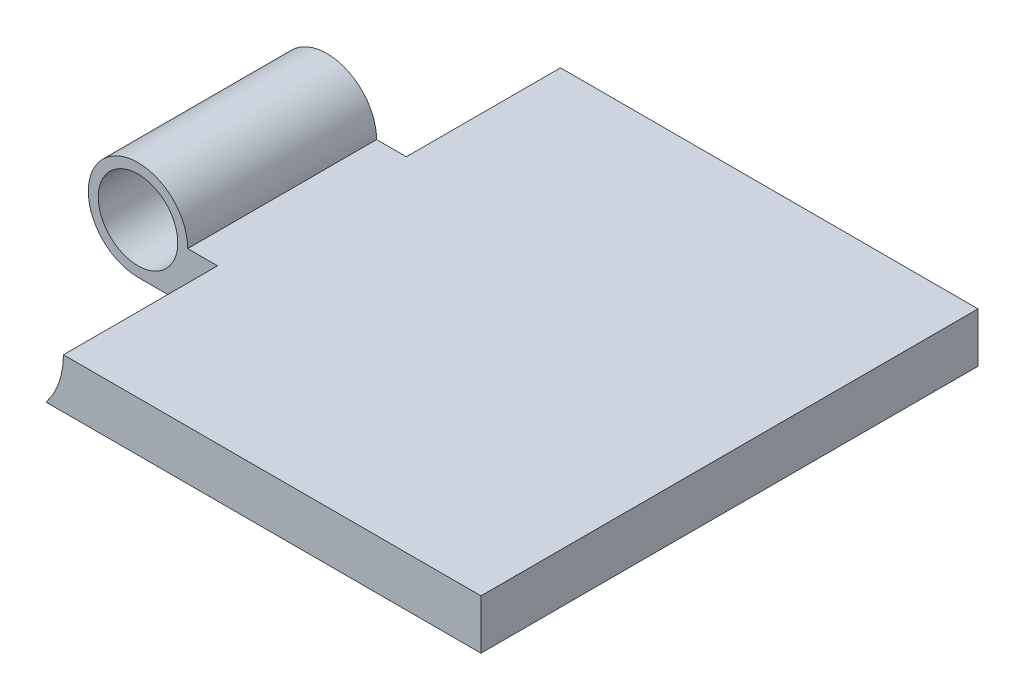
ISO-10303-21;
HEADER;
FILE_DESCRIPTION(('STEP AP214'),'2;1');
FILE_NAME('part.step','',(''),(''),'','','');
FILE_SCHEMA(('AUTOMOTIVE_DESIGN { 1 0 10303 214 1 1 1 1 }'));
ENDSEC;
DATA;
#1=APPLICATION_CONTEXT('core data for automotive mechanical design processes');
#2=APPLICATION_PROTOCOL_DEFINITION('international standard','automotive_design',2000,#1);
#3=PRODUCT_CONTEXT('',#1,'mechanical');
#4=PRODUCT('Part','Part','',(#3));
#5=PRODUCT_RELATED_PRODUCT_CATEGORY('part','',(#4));
#6=PRODUCT_DEFINITION_FORMATION('','',#4);
#7=PRODUCT_DEFINITION_CONTEXT('part definition',#1,'design');
#8=PRODUCT_DEFINITION('design','',#6,#7);
#9=PRODUCT_DEFINITION_SHAPE('','',#8);
#10=(LENGTH_UNIT() NAMED_UNIT(*) SI_UNIT(.MILLI.,.METRE.));
#11=(NAMED_UNIT(*) PLANE_ANGLE_UNIT() SI_UNIT($,.RADIAN.));
#12=(NAMED_UNIT(*) SI_UNIT($,.STERADIAN.) SOLID_ANGLE_UNIT());
#13=UNCERTAINTY_MEASURE_WITH_UNIT(LENGTH_MEASURE(1.E-05),#10,'distance_accuracy_value','');
#14=(GEOMETRIC_REPRESENTATION_CONTEXT(3) GLOBAL_UNCERTAINTY_ASSIGNED_CONTEXT((#13)) GLOBAL_UNIT_ASSIGNED_CONTEXT((#10,
#11,#12)) REPRESENTATION_CONTEXT('',''));
#15=CARTESIAN_POINT('',(0.,0.,0.));
#16=DIRECTION('',(0.,0.,1.));
#17=DIRECTION('',(1.,0.,0.));
#18=AXIS2_PLACEMENT_3D('',#15,#16,#17);
#19=CARTESIAN_POINT('',(0.,0.,-50.));
#20=DIRECTION('',(0.,-1.,0.));
#21=DIRECTION('',(0.,0.,-1.));
#22=AXIS2_PLACEMENT_3D('',#19,#20,#21);
#23=PLANE('',#22);
#24=DIRECTION('',(0.,0.,1.));
#25=VECTOR('',#24,1.);
#26=CARTESIAN_POINT('',(4.99999999999987,0.,-34.5));
#27=LINE('',#26,#25);
#28=CARTESIAN_POINT('',(5.,0.,-15.5));
#29=VERTEX_POINT('',#28);
#30=CARTESIAN_POINT('',(4.99999999999987,0.,-34.5));
#31=VERTEX_POINT('',#30);
#32=EDGE_CURVE('E101',#29,#31,#27,.F.);
#33=ORIENTED_EDGE('',*,*,#32,.F.);
#34=DIRECTION('',(1.,0.,0.));
#35=VECTOR('',#34,1.);
#36=CARTESIAN_POINT('',(3.99999999999987,0.,-15.5));
#37=LINE('',#36,#35);
#38=CARTESIAN_POINT('',(8.,0.,-15.5));
#39=VERTEX_POINT('',#38);
#40=EDGE_CURVE('E131',#29,#39,#37,.T.);
#41=ORIENTED_EDGE('',*,*,#40,.T.);
#42=DIRECTION('',(0.,0.,1.));
#43=VECTOR('',#42,1.);
#44=CARTESIAN_POINT('',(8.,0.,-50.));
#45=LINE('',#44,#43);
#46=CARTESIAN_POINT('',(8.,0.,0.));
#47=VERTEX_POINT('',#46);
#48=EDGE_CURVE('E137',#39,#47,#45,.T.);
#49=ORIENTED_EDGE('',*,*,#48,.T.);
#50=DIRECTION('',(1.,0.,0.));
#51=VECTOR('',#50,1.);
#52=CARTESIAN_POINT('',(0.,0.,0.));
#53=LINE('',#52,#51);
#54=CARTESIAN_POINT('',(50.,0.,0.));
#55=VERTEX_POINT('',#54);
#56=EDGE_CURVE('E143',#47,#55,#53,.T.);
#57=ORIENTED_EDGE('',*,*,#56,.T.);
#58=DIRECTION('',(0.,0.,1.));
#59=VECTOR('',#58,1.);
#60=CARTESIAN_POINT('',(50.,0.,-50.));
#61=LINE('',#60,#59);
#62=CARTESIAN_POINT('',(50.,0.,-50.));
#63=VERTEX_POINT('',#62);
#64=EDGE_CURVE('E154',#63,#55,#61,.T.);
#65=ORIENTED_EDGE('',*,*,#64,.F.);
#66=DIRECTION('',(1.,0.,0.));
#67=VECTOR('',#66,1.);
#68=CARTESIAN_POINT('',(0.,0.,-50.));
#69=LINE('',#68,#67);
#70=CARTESIAN_POINT('',(8.,0.,-50.));
#71=VERTEX_POINT('',#70);
#72=EDGE_CURVE('E146',#71,#63,#69,.T.);
#73=ORIENTED_EDGE('',*,*,#72,.F.);
#74=CARTESIAN_POINT('',(8.,0.,-34.5));
#75=VERTEX_POINT('',#74);
#76=EDGE_CURVE('E119',#71,#75,#45,.T.);
#77=ORIENTED_EDGE('',*,*,#76,.T.);
#78=DIRECTION('',(1.,0.,0.));
#79=VECTOR('',#78,1.);
#80=CARTESIAN_POINT('',(3.99999999999987,0.,-34.5));
#81=LINE('',#80,#79);
#82=EDGE_CURVE('E48',#31,#75,#81,.T.);
#83=ORIENTED_EDGE('',*,*,#82,.F.);
#84=EDGE_LOOP('',(#33,#41,#49,#57,#65,#73,#77,#83));
#85=FACE_BOUND('',#84,.T.);
#86=ADVANCED_FACE('F33',(#85),#23,.F.);
#87=CARTESIAN_POINT('',(0.,0.,-50.));
#88=DIRECTION('',(0.,0.,1.));
#89=DIRECTION('',(1.,0.,0.));
#90=AXIS2_PLACEMENT_3D('',#87,#88,#89);
#91=CYLINDRICAL_SURFACE('',#90,8.);
#92=CARTESIAN_POINT('',(0.,0.,-15.5));
#93=DIRECTION('',(0.,0.,-1.));
#94=DIRECTION('',(-1.,0.,0.));
#95=AXIS2_PLACEMENT_3D('',#92,#93,#94);
#96=CIRCLE('',#95,8.);
#97=CARTESIAN_POINT('',(6.2449979983984,-5.,-15.5));
#98=VERTEX_POINT('',#97);
#99=EDGE_CURVE('E11',#98,#39,#96,.F.);
#100=ORIENTED_EDGE('',*,*,#99,.F.);
#101=DIRECTION('',(0.,0.,1.));
#102=VECTOR('',#101,1.);
#103=CARTESIAN_POINT('',(6.2449979983984,-5.,-50.));
#104=LINE('',#103,#102);
#105=CARTESIAN_POINT('',(6.2449979983984,-5.,0.));
#106=VERTEX_POINT('',#105);
#107=EDGE_CURVE('E56',#98,#106,#104,.T.);
#108=ORIENTED_EDGE('',*,*,#107,.T.);
#109=CARTESIAN_POINT('',(0.,0.,0.));
#110=DIRECTION('',(0.,0.,1.));
#111=DIRECTION('',(1.,0.,0.));
#112=AXIS2_PLACEMENT_3D('',#109,#110,#111);
#113=CIRCLE('',#112,8.);
#114=EDGE_CURVE('E157',#106,#47,#113,.T.);
#115=ORIENTED_EDGE('',*,*,#114,.T.);
#116=ORIENTED_EDGE('',*,*,#48,.F.);
#117=EDGE_LOOP('',(#100,#108,#115,#116));
#118=FACE_BOUND('',#117,.T.);
#119=ADVANCED_FACE('F185',(#118),#91,.F.);
#120=CARTESIAN_POINT('',(50.,0.,-50.));
#121=DIRECTION('',(-1.,0.,0.));
#122=DIRECTION('',(0.,0.,1.));
#123=AXIS2_PLACEMENT_3D('',#120,#121,#122);
#124=PLANE('',#123);
#125=DIRECTION('',(0.,-1.,0.));
#126=VECTOR('',#125,1.);
#127=CARTESIAN_POINT('',(50.,0.,0.));
#128=LINE('',#127,#126);
#129=CARTESIAN_POINT('',(50.,-5.,0.));
#130=VERTEX_POINT('',#129);
#131=EDGE_CURVE('E150',#55,#130,#128,.T.);
#132=ORIENTED_EDGE('',*,*,#131,.T.);
#133=DIRECTION('',(0.,0.,1.));
#134=VECTOR('',#133,1.);
#135=CARTESIAN_POINT('',(50.,-5.,-50.));
#136=LINE('',#135,#134);
#137=CARTESIAN_POINT('',(50.,-5.,-50.));
#138=VERTEX_POINT('',#137);
#139=EDGE_CURVE('E148',#138,#130,#136,.T.);
#140=ORIENTED_EDGE('',*,*,#139,.F.);
#141=DIRECTION('',(0.,-1.,0.));
#142=VECTOR('',#141,1.);
#143=CARTESIAN_POINT('',(50.,0.,-50.));
#144=LINE('',#143,#142);
#145=EDGE_CURVE('E142',#63,#138,#144,.T.);
#146=ORIENTED_EDGE('',*,*,#145,.F.);
#147=ORIENTED_EDGE('',*,*,#64,.T.);
#148=EDGE_LOOP('',(#132,#140,#146,#147));
#149=FACE_BOUND('',#148,.T.);
#150=ADVANCED_FACE('F190',(#149),#124,.F.);
#151=CARTESIAN_POINT('',(0.,-5.,-50.));
#152=DIRECTION('',(0.,-1.,0.));
#153=DIRECTION('',(0.,0.,-1.));
#154=AXIS2_PLACEMENT_3D('',#151,#152,#153);
#155=PLANE('',#154);
#156=ORIENTED_EDGE('',*,*,#107,.F.);
#157=DIRECTION('',(1.,0.,0.));
#158=VECTOR('',#157,1.);
#159=CARTESIAN_POINT('',(-1.32676290876039E-13,-5.,-15.5));
#160=LINE('',#159,#158);
#161=CARTESIAN_POINT('',(-1.32676290876039E-13,-5.,-15.5));
#162=VERTEX_POINT('',#161);
#163=EDGE_CURVE('E123',#162,#98,#160,.T.);
#164=ORIENTED_EDGE('',*,*,#163,.F.);
#165=DIRECTION('',(0.,0.,-1.));
#166=VECTOR('',#165,1.);
#167=CARTESIAN_POINT('',(-1.32676290876039E-13,-5.,-15.5));
#168=LINE('',#167,#166);
#169=CARTESIAN_POINT('',(-1.32676290876039E-13,-5.,-34.5));
#170=VERTEX_POINT('',#169);
#171=EDGE_CURVE('E128',#162,#170,#168,.T.);
#172=ORIENTED_EDGE('',*,*,#171,.T.);
#173=DIRECTION('',(1.,0.,0.));
#174=VECTOR('',#173,1.);
#175=CARTESIAN_POINT('',(-1.32676290876039E-13,-5.,-34.5));
#176=LINE('',#175,#174);
#177=CARTESIAN_POINT('',(6.2449979983984,-5.,-34.5));
#178=VERTEX_POINT('',#177);
#179=EDGE_CURVE('E115',#170,#178,#176,.T.);
#180=ORIENTED_EDGE('',*,*,#179,.T.);
#181=CARTESIAN_POINT('',(6.2449979983984,-5.,-50.));
#182=VERTEX_POINT('',#181);
#183=EDGE_CURVE('E134',#182,#178,#104,.T.);
#184=ORIENTED_EDGE('',*,*,#183,.F.);
#185=DIRECTION('',(1.,0.,0.));
#186=VECTOR('',#185,1.);
#187=CARTESIAN_POINT('',(0.,-5.,-50.));
#188=LINE('',#187,#186);
#189=EDGE_CURVE('E140',#182,#138,#188,.T.);
#190=ORIENTED_EDGE('',*,*,#189,.T.);
#191=ORIENTED_EDGE('',*,*,#139,.T.);
#192=DIRECTION('',(1.,0.,0.));
#193=VECTOR('',#192,1.);
#194=CARTESIAN_POINT('',(0.,-5.,0.));
#195=LINE('',#194,#193);
#196=EDGE_CURVE('E139',#106,#130,#195,.T.);
#197=ORIENTED_EDGE('',*,*,#196,.F.);
#198=EDGE_LOOP('',(#156,#164,#172,#180,#184,#190,#191,#197));
#199=FACE_BOUND('',#198,.T.);
#200=ADVANCED_FACE('F35',(#199),#155,.T.);
#201=CARTESIAN_POINT('',(0.,0.,-50.));
#202=DIRECTION('',(0.,0.,1.));
#203=DIRECTION('',(1.,0.,0.));
#204=AXIS2_PLACEMENT_3D('',#201,#202,#203);
#205=PLANE('',#204);
#206=ORIENTED_EDGE('',*,*,#189,.F.);
#207=CARTESIAN_POINT('',(0.,0.,-50.));
#208=DIRECTION('',(0.,0.,1.));
#209=DIRECTION('',(1.,0.,0.));
#210=AXIS2_PLACEMENT_3D('',#207,#208,#209);
#211=CIRCLE('',#210,8.);
#212=EDGE_CURVE('E130',#182,#71,#211,.T.);
#213=ORIENTED_EDGE('',*,*,#212,.T.);
#214=ORIENTED_EDGE('',*,*,#72,.T.);
#215=ORIENTED_EDGE('',*,*,#145,.T.);
#216=EDGE_LOOP('',(#206,#213,#214,#215));
#217=FACE_BOUND('',#216,.T.);
#218=ADVANCED_FACE('F200',(#217),#205,.F.);
#219=CARTESIAN_POINT('',(0.,0.,0.));
#220=DIRECTION('',(0.,0.,1.));
#221=DIRECTION('',(1.,0.,0.));
#222=AXIS2_PLACEMENT_3D('',#219,#220,#221);
#223=PLANE('',#222);
#224=ORIENTED_EDGE('',*,*,#114,.F.);
#225=ORIENTED_EDGE('',*,*,#196,.T.);
#226=ORIENTED_EDGE('',*,*,#131,.F.);
#227=ORIENTED_EDGE('',*,*,#56,.F.);
#228=EDGE_LOOP('',(#224,#225,#226,#227));
#229=FACE_BOUND('',#228,.T.);
#230=ADVANCED_FACE('F193',(#229),#223,.T.);
#231=ORIENTED_EDGE('',*,*,#183,.T.);
#232=CARTESIAN_POINT('',(0.,0.,-34.5));
#233=DIRECTION('',(0.,0.,-1.));
#234=DIRECTION('',(-1.,0.,0.));
#235=AXIS2_PLACEMENT_3D('',#232,#233,#234);
#236=CIRCLE('',#235,8.);
#237=EDGE_CURVE('E41',#178,#75,#236,.F.);
#238=ORIENTED_EDGE('',*,*,#237,.T.);
#239=ORIENTED_EDGE('',*,*,#76,.F.);
#240=ORIENTED_EDGE('',*,*,#212,.F.);
#241=EDGE_LOOP('',(#231,#238,#239,#240));
#242=FACE_BOUND('',#241,.T.);
#243=ADVANCED_FACE('F161',(#242),#91,.F.);
#244=CARTESIAN_POINT('',(-1.32676290876039E-13,0.,-15.5));
#245=DIRECTION('',(0.,0.,-1.));
#246=DIRECTION('',(-1.,0.,0.));
#247=AXIS2_PLACEMENT_3D('',#244,#245,#246);
#248=PLANE('',#247);
#249=ORIENTED_EDGE('',*,*,#40,.F.);
#250=CARTESIAN_POINT('',(0.,0.,-15.5));
#251=DIRECTION('',(0.,0.,-1.));
#252=DIRECTION('',(-1.,0.,0.));
#253=AXIS2_PLACEMENT_3D('',#250,#251,#252);
#254=CIRCLE('',#253,5.);
#255=EDGE_CURVE('E106',#162,#29,#254,.T.);
#256=ORIENTED_EDGE('',*,*,#255,.F.);
#257=ORIENTED_EDGE('',*,*,#163,.T.);
#258=ORIENTED_EDGE('',*,*,#99,.T.);
#259=EDGE_LOOP('',(#249,#256,#257,#258));
#260=FACE_BOUND('',#259,.T.);
#261=CARTESIAN_POINT('',(-1.32676290876039E-13,0.,-15.5));
#262=DIRECTION('',(0.,0.,-1.));
#263=DIRECTION('',(-1.,0.,0.));
#264=AXIS2_PLACEMENT_3D('',#261,#262,#263);
#265=CIRCLE('',#264,4.);
#266=CARTESIAN_POINT('',(-4.00000000000013,0.,-15.5));
#267=VERTEX_POINT('',#266);
#268=EDGE_CURVE('E120',#267,#267,#265,.T.);
#269=ORIENTED_EDGE('',*,*,#268,.T.);
#270=EDGE_LOOP('',(#269));
#271=FACE_BOUND('',#270,.T.);
#272=ADVANCED_FACE('F166',(#260,#271),#248,.F.);
#273=CARTESIAN_POINT('',(-1.32676290876039E-13,0.,-34.5));
#274=DIRECTION('',(0.,0.,-1.));
#275=DIRECTION('',(-1.,0.,0.));
#276=AXIS2_PLACEMENT_3D('',#273,#274,#275);
#277=PLANE('',#276);
#278=CARTESIAN_POINT('',(-1.32676290876039E-13,0.,-34.5));
#279=DIRECTION('',(0.,0.,-1.));
#280=DIRECTION('',(-1.,0.,0.));
#281=AXIS2_PLACEMENT_3D('',#278,#279,#280);
#282=CIRCLE('',#281,5.);
#283=EDGE_CURVE('E104',#170,#31,#282,.T.);
#284=ORIENTED_EDGE('',*,*,#283,.T.);
#285=ORIENTED_EDGE('',*,*,#82,.T.);
#286=ORIENTED_EDGE('',*,*,#237,.F.);
#287=ORIENTED_EDGE('',*,*,#179,.F.);
#288=EDGE_LOOP('',(#284,#285,#286,#287));
#289=FACE_BOUND('',#288,.T.);
#290=CARTESIAN_POINT('',(-1.32676290876039E-13,0.,-34.5));
#291=DIRECTION('',(0.,0.,-1.));
#292=DIRECTION('',(-1.,0.,0.));
#293=AXIS2_PLACEMENT_3D('',#290,#291,#292);
#294=CIRCLE('',#293,4.);
#295=CARTESIAN_POINT('',(-4.00000000000013,0.,-34.5));
#296=VERTEX_POINT('',#295);
#297=EDGE_CURVE('E109',#296,#296,#294,.T.);
#298=ORIENTED_EDGE('',*,*,#297,.F.);
#299=EDGE_LOOP('',(#298));
#300=FACE_BOUND('',#299,.T.);
#301=ADVANCED_FACE('F112',(#289,#300),#277,.T.);
#302=CARTESIAN_POINT('',(-1.32676290876039E-13,0.,-15.5));
#303=DIRECTION('',(0.,0.,-1.));
#304=DIRECTION('',(-1.,0.,0.));
#305=AXIS2_PLACEMENT_3D('',#302,#303,#304);
#306=CYLINDRICAL_SURFACE('',#305,4.);
#307=ORIENTED_EDGE('',*,*,#297,.T.);
#308=EDGE_LOOP('',(#307));
#309=FACE_BOUND('',#308,.T.);
#310=ORIENTED_EDGE('',*,*,#268,.F.);
#311=EDGE_LOOP('',(#310));
#312=FACE_BOUND('',#311,.T.);
#313=ADVANCED_FACE('F174',(#309,#312),#306,.F.);
#314=CARTESIAN_POINT('',(-1.32676290876039E-13,0.,-34.5));
#315=DIRECTION('',(0.,0.,1.));
#316=DIRECTION('',(1.,0.,0.));
#317=AXIS2_PLACEMENT_3D('',#314,#315,#316);
#318=CYLINDRICAL_SURFACE('',#317,5.);
#319=ORIENTED_EDGE('',*,*,#255,.T.);
#320=ORIENTED_EDGE('',*,*,#32,.T.);
#321=ORIENTED_EDGE('',*,*,#283,.F.);
#322=ORIENTED_EDGE('',*,*,#171,.F.);
#323=EDGE_LOOP('',(#319,#320,#321,#322));
#324=FACE_BOUND('',#323,.T.);
#325=ADVANCED_FACE('F102',(#324),#318,.T.);
#326=CLOSED_SHELL('',(#86,#119,#150,#200,#218,#230,#243,#272,#301,#313,#325));
#327=MANIFOLD_SOLID_BREP('B2',#326);
#328=ADVANCED_BREP_SHAPE_REPRESENTATION('',(#18,#327),#14);
#329=SHAPE_DEFINITION_REPRESENTATION(#9,#328);
ENDSEC;
END-ISO-10303-21;
